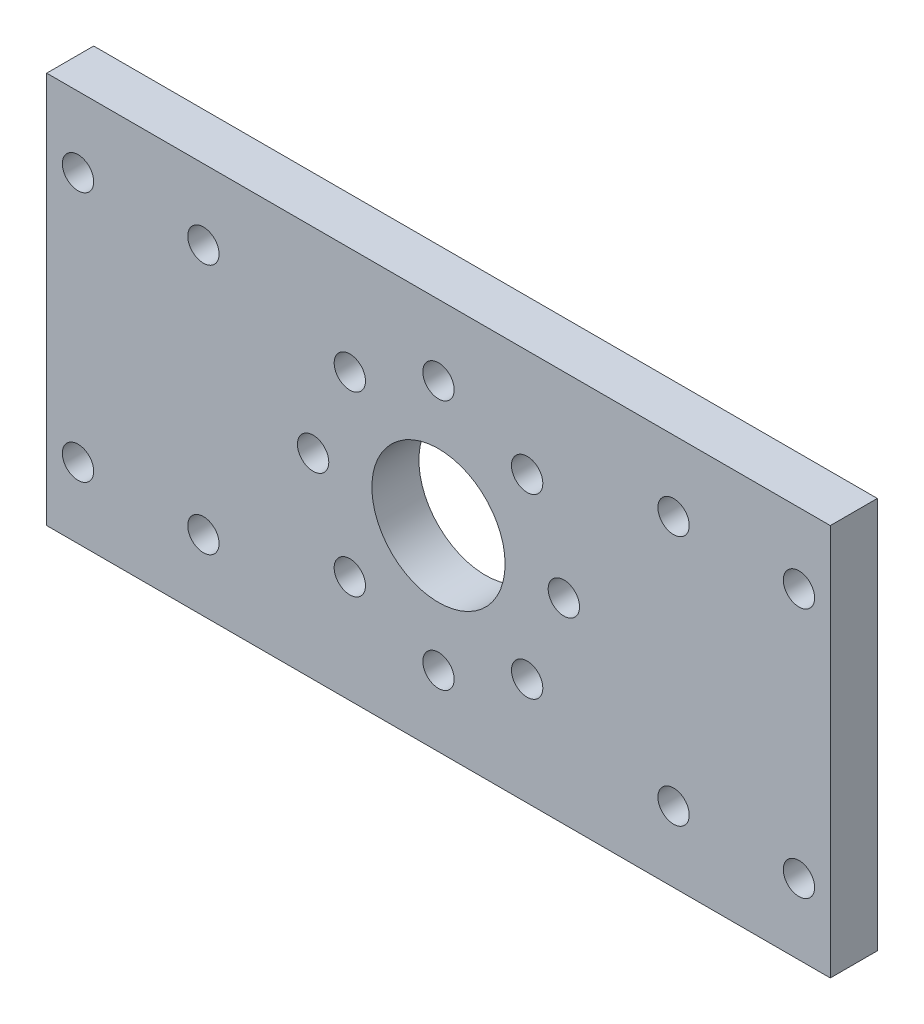
ISO-10303-21;
HEADER;
FILE_DESCRIPTION(('STEP AP214'),'2;1');
FILE_NAME('part.step','',(''),(''),'','','');
FILE_SCHEMA(('AUTOMOTIVE_DESIGN { 1 0 10303 214 1 1 1 1 }'));
ENDSEC;
DATA;
#1=APPLICATION_CONTEXT('core data for automotive mechanical design processes');
#2=APPLICATION_PROTOCOL_DEFINITION('international standard','automotive_design',2000,#1);
#3=PRODUCT_CONTEXT('',#1,'mechanical');
#4=PRODUCT('Part','Part','',(#3));
#5=PRODUCT_RELATED_PRODUCT_CATEGORY('part','',(#4));
#6=PRODUCT_DEFINITION_FORMATION('','',#4);
#7=PRODUCT_DEFINITION_CONTEXT('part definition',#1,'design');
#8=PRODUCT_DEFINITION('design','',#6,#7);
#9=PRODUCT_DEFINITION_SHAPE('','',#8);
#10=(LENGTH_UNIT() NAMED_UNIT(*) SI_UNIT(.MILLI.,.METRE.));
#11=(NAMED_UNIT(*) PLANE_ANGLE_UNIT() SI_UNIT($,.RADIAN.));
#12=(NAMED_UNIT(*) SI_UNIT($,.STERADIAN.) SOLID_ANGLE_UNIT());
#13=UNCERTAINTY_MEASURE_WITH_UNIT(LENGTH_MEASURE(1.E-05),#10,'distance_accuracy_value','');
#14=(GEOMETRIC_REPRESENTATION_CONTEXT(3) GLOBAL_UNCERTAINTY_ASSIGNED_CONTEXT((#13)) GLOBAL_UNIT_ASSIGNED_CONTEXT((#10,
#11,#12)) REPRESENTATION_CONTEXT('',''));
#15=CARTESIAN_POINT('',(0.,0.,0.));
#16=DIRECTION('',(0.,0.,1.));
#17=DIRECTION('',(1.,0.,0.));
#18=AXIS2_PLACEMENT_3D('',#15,#16,#17);
#19=CARTESIAN_POINT('',(0.,0.,3.));
#20=DIRECTION('',(0.,0.,1.));
#21=DIRECTION('',(1.,0.,0.));
#22=AXIS2_PLACEMENT_3D('',#19,#20,#21);
#23=PLANE('',#22);
#24=CARTESIAN_POINT('',(-23.,-8.,3.));
#25=DIRECTION('',(0.,0.,1.));
#26=DIRECTION('',(-1.,0.,0.));
#27=AXIS2_PLACEMENT_3D('',#24,#25,#26);
#28=CIRCLE('',#27,1.);
#29=CARTESIAN_POINT('',(-24.,-8.,3.));
#30=VERTEX_POINT('',#29);
#31=EDGE_CURVE('E200',#30,#30,#28,.T.);
#32=ORIENTED_EDGE('',*,*,#31,.F.);
#33=EDGE_LOOP('',(#32));
#34=FACE_BOUND('',#33,.T.);
#35=CARTESIAN_POINT('',(23.,8.,3.));
#36=DIRECTION('',(0.,0.,1.));
#37=DIRECTION('',(1.,0.,0.));
#38=AXIS2_PLACEMENT_3D('',#35,#36,#37);
#39=CIRCLE('',#38,1.);
#40=CARTESIAN_POINT('',(24.,8.,3.));
#41=VERTEX_POINT('',#40);
#42=EDGE_CURVE('E188',#41,#41,#39,.T.);
#43=ORIENTED_EDGE('',*,*,#42,.F.);
#44=EDGE_LOOP('',(#43));
#45=FACE_BOUND('',#44,.T.);
#46=CARTESIAN_POINT('',(15.,-8.,3.));
#47=DIRECTION('',(0.,0.,1.));
#48=DIRECTION('',(-1.,0.,0.));
#49=AXIS2_PLACEMENT_3D('',#46,#47,#48);
#50=CIRCLE('',#49,1.);
#51=CARTESIAN_POINT('',(14.,-8.,3.));
#52=VERTEX_POINT('',#51);
#53=EDGE_CURVE('E176',#52,#52,#50,.T.);
#54=ORIENTED_EDGE('',*,*,#53,.F.);
#55=EDGE_LOOP('',(#54));
#56=FACE_BOUND('',#55,.T.);
#57=CARTESIAN_POINT('',(-5.65685424949238,5.65685424949238,3.));
#58=DIRECTION('',(0.,0.,1.));
#59=DIRECTION('',(1.,0.,0.));
#60=AXIS2_PLACEMENT_3D('',#57,#58,#59);
#61=CIRCLE('',#60,1.0000000000001);
#62=CARTESIAN_POINT('',(-4.65685424949229,5.65685424949238,3.));
#63=VERTEX_POINT('',#62);
#64=EDGE_CURVE('E164',#63,#63,#61,.T.);
#65=ORIENTED_EDGE('',*,*,#64,.F.);
#66=EDGE_LOOP('',(#65));
#67=FACE_BOUND('',#66,.T.);
#68=CARTESIAN_POINT('',(-5.65685424949238,-5.65685424949238,3.));
#69=DIRECTION('',(0.,0.,1.));
#70=DIRECTION('',(1.,0.,0.));
#71=AXIS2_PLACEMENT_3D('',#68,#69,#70);
#72=CIRCLE('',#71,1.00000000000007);
#73=CARTESIAN_POINT('',(-4.65685424949231,-5.65685424949238,3.));
#74=VERTEX_POINT('',#73);
#75=EDGE_CURVE('E152',#74,#74,#72,.T.);
#76=ORIENTED_EDGE('',*,*,#75,.F.);
#77=EDGE_LOOP('',(#76));
#78=FACE_BOUND('',#77,.T.);
#79=CARTESIAN_POINT('',(5.65685424949238,-5.65685424949238,3.));
#80=DIRECTION('',(0.,0.,1.));
#81=DIRECTION('',(1.,0.,0.));
#82=AXIS2_PLACEMENT_3D('',#79,#80,#81);
#83=CIRCLE('',#82,1.00000000000004);
#84=CARTESIAN_POINT('',(6.65685424949242,-5.65685424949238,3.));
#85=VERTEX_POINT('',#84);
#86=EDGE_CURVE('E140',#85,#85,#83,.T.);
#87=ORIENTED_EDGE('',*,*,#86,.F.);
#88=EDGE_LOOP('',(#87));
#89=FACE_BOUND('',#88,.T.);
#90=CARTESIAN_POINT('',(5.65685424949238,5.65685424949238,3.));
#91=DIRECTION('',(0.,0.,1.));
#92=DIRECTION('',(1.,0.,0.));
#93=AXIS2_PLACEMENT_3D('',#90,#91,#92);
#94=CIRCLE('',#93,1.00000000000001);
#95=CARTESIAN_POINT('',(6.65685424949239,5.65685424949238,3.));
#96=VERTEX_POINT('',#95);
#97=EDGE_CURVE('E128',#96,#96,#94,.T.);
#98=ORIENTED_EDGE('',*,*,#97,.F.);
#99=EDGE_LOOP('',(#98));
#100=FACE_BOUND('',#99,.T.);
#101=CARTESIAN_POINT('',(0.,8.,3.));
#102=DIRECTION('',(0.,0.,1.));
#103=DIRECTION('',(1.,0.,0.));
#104=AXIS2_PLACEMENT_3D('',#101,#102,#103);
#105=CIRCLE('',#104,1.);
#106=CARTESIAN_POINT('',(1.,8.,3.));
#107=VERTEX_POINT('',#106);
#108=EDGE_CURVE('E116',#107,#107,#105,.T.);
#109=ORIENTED_EDGE('',*,*,#108,.F.);
#110=EDGE_LOOP('',(#109));
#111=FACE_BOUND('',#110,.T.);
#112=DIRECTION('',(0.,1.,0.));
#113=VECTOR('',#112,1.);
#114=CARTESIAN_POINT('',(25.,12.5,3.));
#115=LINE('',#114,#113);
#116=CARTESIAN_POINT('',(25.,-12.5,3.));
#117=VERTEX_POINT('',#116);
#118=CARTESIAN_POINT('',(25.,12.5,3.));
#119=VERTEX_POINT('',#118);
#120=EDGE_CURVE('E86',#117,#119,#115,.T.);
#121=ORIENTED_EDGE('',*,*,#120,.T.);
#122=DIRECTION('',(-1.,0.,0.));
#123=VECTOR('',#122,1.);
#124=CARTESIAN_POINT('',(-25.,12.5,3.));
#125=LINE('',#124,#123);
#126=CARTESIAN_POINT('',(-25.,12.5,3.));
#127=VERTEX_POINT('',#126);
#128=EDGE_CURVE('E81',#119,#127,#125,.T.);
#129=ORIENTED_EDGE('',*,*,#128,.T.);
#130=DIRECTION('',(0.,-1.,0.));
#131=VECTOR('',#130,1.);
#132=CARTESIAN_POINT('',(-25.,12.5,3.));
#133=LINE('',#132,#131);
#134=CARTESIAN_POINT('',(-25.,-12.5,3.));
#135=VERTEX_POINT('',#134);
#136=EDGE_CURVE('E84',#127,#135,#133,.T.);
#137=ORIENTED_EDGE('',*,*,#136,.T.);
#138=DIRECTION('',(1.,0.,0.));
#139=VECTOR('',#138,1.);
#140=CARTESIAN_POINT('',(-25.,-12.5,3.));
#141=LINE('',#140,#139);
#142=EDGE_CURVE('E51',#135,#117,#141,.T.);
#143=ORIENTED_EDGE('',*,*,#142,.T.);
#144=EDGE_LOOP('',(#121,#129,#137,#143));
#145=FACE_BOUND('',#144,.T.);
#146=CARTESIAN_POINT('',(0.,0.,3.));
#147=DIRECTION('',(0.,0.,1.));
#148=DIRECTION('',(1.,0.,0.));
#149=AXIS2_PLACEMENT_3D('',#146,#147,#148);
#150=CIRCLE('',#149,4.25);
#151=CARTESIAN_POINT('',(4.24999999999999,0.,3.));
#152=VERTEX_POINT('',#151);
#153=EDGE_CURVE('E101',#152,#152,#150,.T.);
#154=ORIENTED_EDGE('',*,*,#153,.F.);
#155=EDGE_LOOP('',(#154));
#156=FACE_BOUND('',#155,.T.);
#157=CARTESIAN_POINT('',(-15.,-8.,3.));
#158=DIRECTION('',(0.,0.,1.));
#159=DIRECTION('',(1.,0.,0.));
#160=AXIS2_PLACEMENT_3D('',#157,#158,#159);
#161=CIRCLE('',#160,1.);
#162=CARTESIAN_POINT('',(-14.,-8.,3.));
#163=VERTEX_POINT('',#162);
#164=EDGE_CURVE('E122',#163,#163,#161,.T.);
#165=ORIENTED_EDGE('',*,*,#164,.F.);
#166=EDGE_LOOP('',(#165));
#167=FACE_BOUND('',#166,.T.);
#168=CARTESIAN_POINT('',(8.,0.,3.));
#169=DIRECTION('',(0.,0.,1.));
#170=DIRECTION('',(1.,0.,0.));
#171=AXIS2_PLACEMENT_3D('',#168,#169,#170);
#172=CIRCLE('',#171,1.00000000000003);
#173=CARTESIAN_POINT('',(9.00000000000002,0.,3.));
#174=VERTEX_POINT('',#173);
#175=EDGE_CURVE('E134',#174,#174,#172,.T.);
#176=ORIENTED_EDGE('',*,*,#175,.F.);
#177=EDGE_LOOP('',(#176));
#178=FACE_BOUND('',#177,.T.);
#179=CARTESIAN_POINT('',(0.,-8.,3.));
#180=DIRECTION('',(0.,0.,1.));
#181=DIRECTION('',(1.,0.,0.));
#182=AXIS2_PLACEMENT_3D('',#179,#180,#181);
#183=CIRCLE('',#182,1.00000000000005);
#184=CARTESIAN_POINT('',(1.00000000000005,-8.,3.));
#185=VERTEX_POINT('',#184);
#186=EDGE_CURVE('E146',#185,#185,#183,.T.);
#187=ORIENTED_EDGE('',*,*,#186,.F.);
#188=EDGE_LOOP('',(#187));
#189=FACE_BOUND('',#188,.T.);
#190=CARTESIAN_POINT('',(-8.,0.,3.));
#191=DIRECTION('',(0.,0.,1.));
#192=DIRECTION('',(1.,0.,0.));
#193=AXIS2_PLACEMENT_3D('',#190,#191,#192);
#194=CIRCLE('',#193,1.00000000000008);
#195=CARTESIAN_POINT('',(-6.99999999999992,0.,3.));
#196=VERTEX_POINT('',#195);
#197=EDGE_CURVE('E158',#196,#196,#194,.T.);
#198=ORIENTED_EDGE('',*,*,#197,.F.);
#199=EDGE_LOOP('',(#198));
#200=FACE_BOUND('',#199,.T.);
#201=CARTESIAN_POINT('',(-15.,8.,3.));
#202=DIRECTION('',(0.,0.,1.));
#203=DIRECTION('',(1.,0.,0.));
#204=AXIS2_PLACEMENT_3D('',#201,#202,#203);
#205=CIRCLE('',#204,1.);
#206=CARTESIAN_POINT('',(-14.,8.,3.));
#207=VERTEX_POINT('',#206);
#208=EDGE_CURVE('E170',#207,#207,#205,.T.);
#209=ORIENTED_EDGE('',*,*,#208,.F.);
#210=EDGE_LOOP('',(#209));
#211=FACE_BOUND('',#210,.T.);
#212=CARTESIAN_POINT('',(15.,8.,3.));
#213=DIRECTION('',(0.,0.,1.));
#214=DIRECTION('',(-1.,0.,0.));
#215=AXIS2_PLACEMENT_3D('',#212,#213,#214);
#216=CIRCLE('',#215,1.00000000000001);
#217=CARTESIAN_POINT('',(14.,8.,3.));
#218=VERTEX_POINT('',#217);
#219=EDGE_CURVE('E182',#218,#218,#216,.T.);
#220=ORIENTED_EDGE('',*,*,#219,.F.);
#221=EDGE_LOOP('',(#220));
#222=FACE_BOUND('',#221,.T.);
#223=CARTESIAN_POINT('',(23.,-8.,3.));
#224=DIRECTION('',(0.,0.,1.));
#225=DIRECTION('',(1.,0.,0.));
#226=AXIS2_PLACEMENT_3D('',#223,#224,#225);
#227=CIRCLE('',#226,1.);
#228=CARTESIAN_POINT('',(24.,-8.,3.));
#229=VERTEX_POINT('',#228);
#230=EDGE_CURVE('E194',#229,#229,#227,.T.);
#231=ORIENTED_EDGE('',*,*,#230,.F.);
#232=EDGE_LOOP('',(#231));
#233=FACE_BOUND('',#232,.T.);
#234=CARTESIAN_POINT('',(-23.,8.,3.));
#235=DIRECTION('',(0.,0.,1.));
#236=DIRECTION('',(-1.,0.,0.));
#237=AXIS2_PLACEMENT_3D('',#234,#235,#236);
#238=CIRCLE('',#237,1.);
#239=CARTESIAN_POINT('',(-24.,8.,3.));
#240=VERTEX_POINT('',#239);
#241=EDGE_CURVE('E206',#240,#240,#238,.T.);
#242=ORIENTED_EDGE('',*,*,#241,.F.);
#243=EDGE_LOOP('',(#242));
#244=FACE_BOUND('',#243,.T.);
#245=ADVANCED_FACE('F34',(#34,#45,#56,#67,#78,#89,#100,#111,#145,#156,#167,#178,#189,#200,#211,
#222,#233,#244),#23,.T.);
#246=CARTESIAN_POINT('',(0.,0.,0.));
#247=DIRECTION('',(0.,0.,1.));
#248=DIRECTION('',(1.,0.,0.));
#249=AXIS2_PLACEMENT_3D('',#246,#247,#248);
#250=PLANE('',#249);
#251=DIRECTION('',(0.,1.,0.));
#252=VECTOR('',#251,1.);
#253=CARTESIAN_POINT('',(25.,12.5,0.));
#254=LINE('',#253,#252);
#255=CARTESIAN_POINT('',(25.,-12.5,0.));
#256=VERTEX_POINT('',#255);
#257=CARTESIAN_POINT('',(25.,12.5,0.));
#258=VERTEX_POINT('',#257);
#259=EDGE_CURVE('E98',#256,#258,#254,.T.);
#260=ORIENTED_EDGE('',*,*,#259,.F.);
#261=DIRECTION('',(1.,0.,0.));
#262=VECTOR('',#261,1.);
#263=CARTESIAN_POINT('',(-25.,-12.5,0.));
#264=LINE('',#263,#262);
#265=CARTESIAN_POINT('',(-25.,-12.5,0.));
#266=VERTEX_POINT('',#265);
#267=EDGE_CURVE('E74',#266,#256,#264,.T.);
#268=ORIENTED_EDGE('',*,*,#267,.F.);
#269=DIRECTION('',(0.,-1.,0.));
#270=VECTOR('',#269,1.);
#271=CARTESIAN_POINT('',(-25.,12.5,0.));
#272=LINE('',#271,#270);
#273=CARTESIAN_POINT('',(-25.,12.5,0.));
#274=VERTEX_POINT('',#273);
#275=EDGE_CURVE('E68',#274,#266,#272,.T.);
#276=ORIENTED_EDGE('',*,*,#275,.F.);
#277=DIRECTION('',(-1.,0.,0.));
#278=VECTOR('',#277,1.);
#279=CARTESIAN_POINT('',(-25.,12.5,0.));
#280=LINE('',#279,#278);
#281=EDGE_CURVE('E90',#258,#274,#280,.T.);
#282=ORIENTED_EDGE('',*,*,#281,.F.);
#283=EDGE_LOOP('',(#260,#268,#276,#282));
#284=FACE_BOUND('',#283,.T.);
#285=CARTESIAN_POINT('',(0.,0.,0.));
#286=DIRECTION('',(0.,0.,1.));
#287=DIRECTION('',(1.,0.,0.));
#288=AXIS2_PLACEMENT_3D('',#285,#286,#287);
#289=CIRCLE('',#288,4.25);
#290=CARTESIAN_POINT('',(4.24999999999999,0.,0.));
#291=VERTEX_POINT('',#290);
#292=EDGE_CURVE('E113',#291,#291,#289,.T.);
#293=ORIENTED_EDGE('',*,*,#292,.T.);
#294=EDGE_LOOP('',(#293));
#295=FACE_BOUND('',#294,.T.);
#296=CARTESIAN_POINT('',(0.,8.,0.));
#297=DIRECTION('',(0.,0.,1.));
#298=DIRECTION('',(1.,0.,0.));
#299=AXIS2_PLACEMENT_3D('',#296,#297,#298);
#300=CIRCLE('',#299,1.);
#301=CARTESIAN_POINT('',(1.,8.,0.));
#302=VERTEX_POINT('',#301);
#303=EDGE_CURVE('E119',#302,#302,#300,.T.);
#304=ORIENTED_EDGE('',*,*,#303,.T.);
#305=EDGE_LOOP('',(#304));
#306=FACE_BOUND('',#305,.T.);
#307=CARTESIAN_POINT('',(-15.,-8.,0.));
#308=DIRECTION('',(0.,0.,1.));
#309=DIRECTION('',(1.,0.,0.));
#310=AXIS2_PLACEMENT_3D('',#307,#308,#309);
#311=CIRCLE('',#310,1.);
#312=CARTESIAN_POINT('',(-14.,-8.,0.));
#313=VERTEX_POINT('',#312);
#314=EDGE_CURVE('E125',#313,#313,#311,.T.);
#315=ORIENTED_EDGE('',*,*,#314,.T.);
#316=EDGE_LOOP('',(#315));
#317=FACE_BOUND('',#316,.T.);
#318=CARTESIAN_POINT('',(5.65685424949238,5.65685424949238,0.));
#319=DIRECTION('',(0.,0.,1.));
#320=DIRECTION('',(1.,0.,0.));
#321=AXIS2_PLACEMENT_3D('',#318,#319,#320);
#322=CIRCLE('',#321,1.00000000000001);
#323=CARTESIAN_POINT('',(6.65685424949239,5.65685424949238,0.));
#324=VERTEX_POINT('',#323);
#325=EDGE_CURVE('E131',#324,#324,#322,.T.);
#326=ORIENTED_EDGE('',*,*,#325,.T.);
#327=EDGE_LOOP('',(#326));
#328=FACE_BOUND('',#327,.T.);
#329=CARTESIAN_POINT('',(8.,0.,0.));
#330=DIRECTION('',(0.,0.,1.));
#331=DIRECTION('',(1.,0.,0.));
#332=AXIS2_PLACEMENT_3D('',#329,#330,#331);
#333=CIRCLE('',#332,1.00000000000003);
#334=CARTESIAN_POINT('',(9.00000000000002,0.,0.));
#335=VERTEX_POINT('',#334);
#336=EDGE_CURVE('E137',#335,#335,#333,.T.);
#337=ORIENTED_EDGE('',*,*,#336,.T.);
#338=EDGE_LOOP('',(#337));
#339=FACE_BOUND('',#338,.T.);
#340=CARTESIAN_POINT('',(5.65685424949238,-5.65685424949238,0.));
#341=DIRECTION('',(0.,0.,1.));
#342=DIRECTION('',(1.,0.,0.));
#343=AXIS2_PLACEMENT_3D('',#340,#341,#342);
#344=CIRCLE('',#343,1.00000000000004);
#345=CARTESIAN_POINT('',(6.65685424949242,-5.65685424949238,0.));
#346=VERTEX_POINT('',#345);
#347=EDGE_CURVE('E143',#346,#346,#344,.T.);
#348=ORIENTED_EDGE('',*,*,#347,.T.);
#349=EDGE_LOOP('',(#348));
#350=FACE_BOUND('',#349,.T.);
#351=CARTESIAN_POINT('',(0.,-8.,0.));
#352=DIRECTION('',(0.,0.,1.));
#353=DIRECTION('',(1.,0.,0.));
#354=AXIS2_PLACEMENT_3D('',#351,#352,#353);
#355=CIRCLE('',#354,1.00000000000005);
#356=CARTESIAN_POINT('',(1.00000000000005,-8.,0.));
#357=VERTEX_POINT('',#356);
#358=EDGE_CURVE('E149',#357,#357,#355,.T.);
#359=ORIENTED_EDGE('',*,*,#358,.T.);
#360=EDGE_LOOP('',(#359));
#361=FACE_BOUND('',#360,.T.);
#362=CARTESIAN_POINT('',(-5.65685424949238,-5.65685424949238,0.));
#363=DIRECTION('',(0.,0.,1.));
#364=DIRECTION('',(1.,0.,0.));
#365=AXIS2_PLACEMENT_3D('',#362,#363,#364);
#366=CIRCLE('',#365,1.00000000000007);
#367=CARTESIAN_POINT('',(-4.65685424949231,-5.65685424949238,0.));
#368=VERTEX_POINT('',#367);
#369=EDGE_CURVE('E155',#368,#368,#366,.T.);
#370=ORIENTED_EDGE('',*,*,#369,.T.);
#371=EDGE_LOOP('',(#370));
#372=FACE_BOUND('',#371,.T.);
#373=CARTESIAN_POINT('',(-8.,0.,0.));
#374=DIRECTION('',(0.,0.,1.));
#375=DIRECTION('',(1.,0.,0.));
#376=AXIS2_PLACEMENT_3D('',#373,#374,#375);
#377=CIRCLE('',#376,1.00000000000008);
#378=CARTESIAN_POINT('',(-6.99999999999992,0.,0.));
#379=VERTEX_POINT('',#378);
#380=EDGE_CURVE('E161',#379,#379,#377,.T.);
#381=ORIENTED_EDGE('',*,*,#380,.T.);
#382=EDGE_LOOP('',(#381));
#383=FACE_BOUND('',#382,.T.);
#384=CARTESIAN_POINT('',(-5.65685424949238,5.65685424949238,0.));
#385=DIRECTION('',(0.,0.,1.));
#386=DIRECTION('',(1.,0.,0.));
#387=AXIS2_PLACEMENT_3D('',#384,#385,#386);
#388=CIRCLE('',#387,1.0000000000001);
#389=CARTESIAN_POINT('',(-4.65685424949229,5.65685424949238,0.));
#390=VERTEX_POINT('',#389);
#391=EDGE_CURVE('E167',#390,#390,#388,.T.);
#392=ORIENTED_EDGE('',*,*,#391,.T.);
#393=EDGE_LOOP('',(#392));
#394=FACE_BOUND('',#393,.T.);
#395=CARTESIAN_POINT('',(-15.,8.,0.));
#396=DIRECTION('',(0.,0.,1.));
#397=DIRECTION('',(1.,0.,0.));
#398=AXIS2_PLACEMENT_3D('',#395,#396,#397);
#399=CIRCLE('',#398,1.);
#400=CARTESIAN_POINT('',(-14.,8.,0.));
#401=VERTEX_POINT('',#400);
#402=EDGE_CURVE('E173',#401,#401,#399,.T.);
#403=ORIENTED_EDGE('',*,*,#402,.T.);
#404=EDGE_LOOP('',(#403));
#405=FACE_BOUND('',#404,.T.);
#406=CARTESIAN_POINT('',(15.,-8.,0.));
#407=DIRECTION('',(0.,0.,1.));
#408=DIRECTION('',(-1.,0.,0.));
#409=AXIS2_PLACEMENT_3D('',#406,#407,#408);
#410=CIRCLE('',#409,1.);
#411=CARTESIAN_POINT('',(14.,-8.,0.));
#412=VERTEX_POINT('',#411);
#413=EDGE_CURVE('E179',#412,#412,#410,.T.);
#414=ORIENTED_EDGE('',*,*,#413,.T.);
#415=EDGE_LOOP('',(#414));
#416=FACE_BOUND('',#415,.T.);
#417=CARTESIAN_POINT('',(15.,8.,0.));
#418=DIRECTION('',(0.,0.,1.));
#419=DIRECTION('',(-1.,0.,0.));
#420=AXIS2_PLACEMENT_3D('',#417,#418,#419);
#421=CIRCLE('',#420,1.00000000000001);
#422=CARTESIAN_POINT('',(14.,8.,0.));
#423=VERTEX_POINT('',#422);
#424=EDGE_CURVE('E185',#423,#423,#421,.T.);
#425=ORIENTED_EDGE('',*,*,#424,.T.);
#426=EDGE_LOOP('',(#425));
#427=FACE_BOUND('',#426,.T.);
#428=CARTESIAN_POINT('',(23.,8.,0.));
#429=DIRECTION('',(0.,0.,1.));
#430=DIRECTION('',(1.,0.,0.));
#431=AXIS2_PLACEMENT_3D('',#428,#429,#430);
#432=CIRCLE('',#431,1.);
#433=CARTESIAN_POINT('',(24.,8.,0.));
#434=VERTEX_POINT('',#433);
#435=EDGE_CURVE('E191',#434,#434,#432,.T.);
#436=ORIENTED_EDGE('',*,*,#435,.T.);
#437=EDGE_LOOP('',(#436));
#438=FACE_BOUND('',#437,.T.);
#439=CARTESIAN_POINT('',(23.,-8.,0.));
#440=DIRECTION('',(0.,0.,1.));
#441=DIRECTION('',(1.,0.,0.));
#442=AXIS2_PLACEMENT_3D('',#439,#440,#441);
#443=CIRCLE('',#442,1.);
#444=CARTESIAN_POINT('',(24.,-8.,0.));
#445=VERTEX_POINT('',#444);
#446=EDGE_CURVE('E197',#445,#445,#443,.T.);
#447=ORIENTED_EDGE('',*,*,#446,.T.);
#448=EDGE_LOOP('',(#447));
#449=FACE_BOUND('',#448,.T.);
#450=CARTESIAN_POINT('',(-23.,-8.,0.));
#451=DIRECTION('',(0.,0.,1.));
#452=DIRECTION('',(-1.,0.,0.));
#453=AXIS2_PLACEMENT_3D('',#450,#451,#452);
#454=CIRCLE('',#453,1.);
#455=CARTESIAN_POINT('',(-24.,-8.,0.));
#456=VERTEX_POINT('',#455);
#457=EDGE_CURVE('E203',#456,#456,#454,.T.);
#458=ORIENTED_EDGE('',*,*,#457,.T.);
#459=EDGE_LOOP('',(#458));
#460=FACE_BOUND('',#459,.T.);
#461=CARTESIAN_POINT('',(-23.,8.,0.));
#462=DIRECTION('',(0.,0.,1.));
#463=DIRECTION('',(-1.,0.,0.));
#464=AXIS2_PLACEMENT_3D('',#461,#462,#463);
#465=CIRCLE('',#464,1.);
#466=CARTESIAN_POINT('',(-24.,8.,0.));
#467=VERTEX_POINT('',#466);
#468=EDGE_CURVE('E209',#467,#467,#465,.T.);
#469=ORIENTED_EDGE('',*,*,#468,.T.);
#470=EDGE_LOOP('',(#469));
#471=FACE_BOUND('',#470,.T.);
#472=ADVANCED_FACE('F109',(#284,#295,#306,#317,#328,#339,#350,#361,#372,#383,#394,#405,#416,
#427,#438,#449,#460,#471),#250,.F.);
#473=CARTESIAN_POINT('',(25.,12.5,3.));
#474=DIRECTION('',(-1.,0.,0.));
#475=DIRECTION('',(0.,0.,1.));
#476=AXIS2_PLACEMENT_3D('',#473,#474,#475);
#477=PLANE('',#476);
#478=ORIENTED_EDGE('',*,*,#259,.T.);
#479=DIRECTION('',(0.,0.,-1.));
#480=VECTOR('',#479,1.);
#481=CARTESIAN_POINT('',(25.,12.5,3.));
#482=LINE('',#481,#480);
#483=EDGE_CURVE('E11',#119,#258,#482,.T.);
#484=ORIENTED_EDGE('',*,*,#483,.F.);
#485=ORIENTED_EDGE('',*,*,#120,.F.);
#486=DIRECTION('',(0.,0.,-1.));
#487=VECTOR('',#486,1.);
#488=CARTESIAN_POINT('',(25.,-12.5,3.));
#489=LINE('',#488,#487);
#490=EDGE_CURVE('E94',#117,#256,#489,.T.);
#491=ORIENTED_EDGE('',*,*,#490,.T.);
#492=EDGE_LOOP('',(#478,#484,#485,#491));
#493=FACE_BOUND('',#492,.T.);
#494=ADVANCED_FACE('F36',(#493),#477,.F.);
#495=CARTESIAN_POINT('',(-25.,12.5,3.));
#496=DIRECTION('',(0.,-1.,0.));
#497=DIRECTION('',(0.,0.,-1.));
#498=AXIS2_PLACEMENT_3D('',#495,#496,#497);
#499=PLANE('',#498);
#500=ORIENTED_EDGE('',*,*,#281,.T.);
#501=DIRECTION('',(0.,0.,-1.));
#502=VECTOR('',#501,1.);
#503=CARTESIAN_POINT('',(-25.,12.5,3.));
#504=LINE('',#503,#502);
#505=EDGE_CURVE('E43',#127,#274,#504,.T.);
#506=ORIENTED_EDGE('',*,*,#505,.F.);
#507=ORIENTED_EDGE('',*,*,#128,.F.);
#508=ORIENTED_EDGE('',*,*,#483,.T.);
#509=EDGE_LOOP('',(#500,#506,#507,#508));
#510=FACE_BOUND('',#509,.T.);
#511=ADVANCED_FACE('F89',(#510),#499,.F.);
#512=CARTESIAN_POINT('',(-25.,12.5,3.));
#513=DIRECTION('',(1.,0.,0.));
#514=DIRECTION('',(0.,0.,-1.));
#515=AXIS2_PLACEMENT_3D('',#512,#513,#514);
#516=PLANE('',#515);
#517=ORIENTED_EDGE('',*,*,#275,.T.);
#518=DIRECTION('',(0.,0.,-1.));
#519=VECTOR('',#518,1.);
#520=CARTESIAN_POINT('',(-25.,-12.5,3.));
#521=LINE('',#520,#519);
#522=EDGE_CURVE('E91',#135,#266,#521,.T.);
#523=ORIENTED_EDGE('',*,*,#522,.F.);
#524=ORIENTED_EDGE('',*,*,#136,.F.);
#525=ORIENTED_EDGE('',*,*,#505,.T.);
#526=EDGE_LOOP('',(#517,#523,#524,#525));
#527=FACE_BOUND('',#526,.T.);
#528=ADVANCED_FACE('F92',(#527),#516,.F.);
#529=CARTESIAN_POINT('',(-25.,-12.5,3.));
#530=DIRECTION('',(0.,1.,0.));
#531=DIRECTION('',(0.,0.,1.));
#532=AXIS2_PLACEMENT_3D('',#529,#530,#531);
#533=PLANE('',#532);
#534=ORIENTED_EDGE('',*,*,#267,.T.);
#535=ORIENTED_EDGE('',*,*,#490,.F.);
#536=ORIENTED_EDGE('',*,*,#142,.F.);
#537=ORIENTED_EDGE('',*,*,#522,.T.);
#538=EDGE_LOOP('',(#534,#535,#536,#537));
#539=FACE_BOUND('',#538,.T.);
#540=ADVANCED_FACE('F106',(#539),#533,.F.);
#541=CARTESIAN_POINT('',(0.,0.,3.));
#542=DIRECTION('',(0.,0.,-1.));
#543=DIRECTION('',(-1.,0.,0.));
#544=AXIS2_PLACEMENT_3D('',#541,#542,#543);
#545=CYLINDRICAL_SURFACE('',#544,4.25);
#546=ORIENTED_EDGE('',*,*,#153,.T.);
#547=EDGE_LOOP('',(#546));
#548=FACE_BOUND('',#547,.T.);
#549=ORIENTED_EDGE('',*,*,#292,.F.);
#550=EDGE_LOOP('',(#549));
#551=FACE_BOUND('',#550,.T.);
#552=ADVANCED_FACE('F228',(#548,#551),#545,.F.);
#553=CARTESIAN_POINT('',(0.,8.,3.));
#554=DIRECTION('',(0.,0.,-1.));
#555=DIRECTION('',(-1.,0.,0.));
#556=AXIS2_PLACEMENT_3D('',#553,#554,#555);
#557=CYLINDRICAL_SURFACE('',#556,1.);
#558=ORIENTED_EDGE('',*,*,#108,.T.);
#559=EDGE_LOOP('',(#558));
#560=FACE_BOUND('',#559,.T.);
#561=ORIENTED_EDGE('',*,*,#303,.F.);
#562=EDGE_LOOP('',(#561));
#563=FACE_BOUND('',#562,.T.);
#564=ADVANCED_FACE('F274',(#560,#563),#557,.F.);
#565=CARTESIAN_POINT('',(-15.,-8.,3.));
#566=DIRECTION('',(0.,0.,-1.));
#567=DIRECTION('',(-1.,0.,0.));
#568=AXIS2_PLACEMENT_3D('',#565,#566,#567);
#569=CYLINDRICAL_SURFACE('',#568,1.);
#570=ORIENTED_EDGE('',*,*,#164,.T.);
#571=EDGE_LOOP('',(#570));
#572=FACE_BOUND('',#571,.T.);
#573=ORIENTED_EDGE('',*,*,#314,.F.);
#574=EDGE_LOOP('',(#573));
#575=FACE_BOUND('',#574,.T.);
#576=ADVANCED_FACE('F282',(#572,#575),#569,.F.);
#577=CARTESIAN_POINT('',(5.65685424949238,5.65685424949238,3.));
#578=DIRECTION('',(0.,0.,-1.));
#579=DIRECTION('',(-1.,0.,0.));
#580=AXIS2_PLACEMENT_3D('',#577,#578,#579);
#581=CYLINDRICAL_SURFACE('',#580,1.00000000000001);
#582=ORIENTED_EDGE('',*,*,#97,.T.);
#583=EDGE_LOOP('',(#582));
#584=FACE_BOUND('',#583,.T.);
#585=ORIENTED_EDGE('',*,*,#325,.F.);
#586=EDGE_LOOP('',(#585));
#587=FACE_BOUND('',#586,.T.);
#588=ADVANCED_FACE('F290',(#584,#587),#581,.F.);
#589=CARTESIAN_POINT('',(8.,0.,3.));
#590=DIRECTION('',(0.,0.,-1.));
#591=DIRECTION('',(-1.,0.,0.));
#592=AXIS2_PLACEMENT_3D('',#589,#590,#591);
#593=CYLINDRICAL_SURFACE('',#592,1.00000000000003);
#594=ORIENTED_EDGE('',*,*,#175,.T.);
#595=EDGE_LOOP('',(#594));
#596=FACE_BOUND('',#595,.T.);
#597=ORIENTED_EDGE('',*,*,#336,.F.);
#598=EDGE_LOOP('',(#597));
#599=FACE_BOUND('',#598,.T.);
#600=ADVANCED_FACE('F299',(#596,#599),#593,.F.);
#601=CARTESIAN_POINT('',(5.65685424949238,-5.65685424949238,3.));
#602=DIRECTION('',(0.,0.,-1.));
#603=DIRECTION('',(-1.,0.,0.));
#604=AXIS2_PLACEMENT_3D('',#601,#602,#603);
#605=CYLINDRICAL_SURFACE('',#604,1.00000000000004);
#606=ORIENTED_EDGE('',*,*,#86,.T.);
#607=EDGE_LOOP('',(#606));
#608=FACE_BOUND('',#607,.T.);
#609=ORIENTED_EDGE('',*,*,#347,.F.);
#610=EDGE_LOOP('',(#609));
#611=FACE_BOUND('',#610,.T.);
#612=ADVANCED_FACE('F308',(#608,#611),#605,.F.);
#613=CARTESIAN_POINT('',(0.,-8.,3.));
#614=DIRECTION('',(0.,0.,-1.));
#615=DIRECTION('',(-1.,0.,0.));
#616=AXIS2_PLACEMENT_3D('',#613,#614,#615);
#617=CYLINDRICAL_SURFACE('',#616,1.00000000000005);
#618=ORIENTED_EDGE('',*,*,#186,.T.);
#619=EDGE_LOOP('',(#618));
#620=FACE_BOUND('',#619,.T.);
#621=ORIENTED_EDGE('',*,*,#358,.F.);
#622=EDGE_LOOP('',(#621));
#623=FACE_BOUND('',#622,.T.);
#624=ADVANCED_FACE('F317',(#620,#623),#617,.F.);
#625=CARTESIAN_POINT('',(-5.65685424949238,-5.65685424949238,3.));
#626=DIRECTION('',(0.,0.,-1.));
#627=DIRECTION('',(-1.,0.,0.));
#628=AXIS2_PLACEMENT_3D('',#625,#626,#627);
#629=CYLINDRICAL_SURFACE('',#628,1.00000000000007);
#630=ORIENTED_EDGE('',*,*,#75,.T.);
#631=EDGE_LOOP('',(#630));
#632=FACE_BOUND('',#631,.T.);
#633=ORIENTED_EDGE('',*,*,#369,.F.);
#634=EDGE_LOOP('',(#633));
#635=FACE_BOUND('',#634,.T.);
#636=ADVANCED_FACE('F326',(#632,#635),#629,.F.);
#637=CARTESIAN_POINT('',(-8.,0.,3.));
#638=DIRECTION('',(0.,0.,-1.));
#639=DIRECTION('',(-1.,0.,0.));
#640=AXIS2_PLACEMENT_3D('',#637,#638,#639);
#641=CYLINDRICAL_SURFACE('',#640,1.00000000000008);
#642=ORIENTED_EDGE('',*,*,#197,.T.);
#643=EDGE_LOOP('',(#642));
#644=FACE_BOUND('',#643,.T.);
#645=ORIENTED_EDGE('',*,*,#380,.F.);
#646=EDGE_LOOP('',(#645));
#647=FACE_BOUND('',#646,.T.);
#648=ADVANCED_FACE('F335',(#644,#647),#641,.F.);
#649=CARTESIAN_POINT('',(-5.65685424949238,5.65685424949238,3.));
#650=DIRECTION('',(0.,0.,-1.));
#651=DIRECTION('',(-1.,0.,0.));
#652=AXIS2_PLACEMENT_3D('',#649,#650,#651);
#653=CYLINDRICAL_SURFACE('',#652,1.0000000000001);
#654=ORIENTED_EDGE('',*,*,#64,.T.);
#655=EDGE_LOOP('',(#654));
#656=FACE_BOUND('',#655,.T.);
#657=ORIENTED_EDGE('',*,*,#391,.F.);
#658=EDGE_LOOP('',(#657));
#659=FACE_BOUND('',#658,.T.);
#660=ADVANCED_FACE('F344',(#656,#659),#653,.F.);
#661=CARTESIAN_POINT('',(-15.,8.,3.));
#662=DIRECTION('',(0.,0.,-1.));
#663=DIRECTION('',(-1.,0.,0.));
#664=AXIS2_PLACEMENT_3D('',#661,#662,#663);
#665=CYLINDRICAL_SURFACE('',#664,1.);
#666=ORIENTED_EDGE('',*,*,#208,.T.);
#667=EDGE_LOOP('',(#666));
#668=FACE_BOUND('',#667,.T.);
#669=ORIENTED_EDGE('',*,*,#402,.F.);
#670=EDGE_LOOP('',(#669));
#671=FACE_BOUND('',#670,.T.);
#672=ADVANCED_FACE('F353',(#668,#671),#665,.F.);
#673=CARTESIAN_POINT('',(15.,-8.,3.));
#674=DIRECTION('',(0.,0.,-1.));
#675=DIRECTION('',(-1.,0.,0.));
#676=AXIS2_PLACEMENT_3D('',#673,#674,#675);
#677=CYLINDRICAL_SURFACE('',#676,1.);
#678=ORIENTED_EDGE('',*,*,#53,.T.);
#679=EDGE_LOOP('',(#678));
#680=FACE_BOUND('',#679,.T.);
#681=ORIENTED_EDGE('',*,*,#413,.F.);
#682=EDGE_LOOP('',(#681));
#683=FACE_BOUND('',#682,.T.);
#684=ADVANCED_FACE('F362',(#680,#683),#677,.F.);
#685=CARTESIAN_POINT('',(15.,8.,3.));
#686=DIRECTION('',(0.,0.,-1.));
#687=DIRECTION('',(-1.,0.,0.));
#688=AXIS2_PLACEMENT_3D('',#685,#686,#687);
#689=CYLINDRICAL_SURFACE('',#688,1.00000000000001);
#690=ORIENTED_EDGE('',*,*,#219,.T.);
#691=EDGE_LOOP('',(#690));
#692=FACE_BOUND('',#691,.T.);
#693=ORIENTED_EDGE('',*,*,#424,.F.);
#694=EDGE_LOOP('',(#693));
#695=FACE_BOUND('',#694,.T.);
#696=ADVANCED_FACE('F371',(#692,#695),#689,.F.);
#697=CARTESIAN_POINT('',(23.,8.,3.));
#698=DIRECTION('',(0.,0.,-1.));
#699=DIRECTION('',(-1.,0.,0.));
#700=AXIS2_PLACEMENT_3D('',#697,#698,#699);
#701=CYLINDRICAL_SURFACE('',#700,1.);
#702=ORIENTED_EDGE('',*,*,#42,.T.);
#703=EDGE_LOOP('',(#702));
#704=FACE_BOUND('',#703,.T.);
#705=ORIENTED_EDGE('',*,*,#435,.F.);
#706=EDGE_LOOP('',(#705));
#707=FACE_BOUND('',#706,.T.);
#708=ADVANCED_FACE('F380',(#704,#707),#701,.F.);
#709=CARTESIAN_POINT('',(23.,-8.,3.));
#710=DIRECTION('',(0.,0.,-1.));
#711=DIRECTION('',(-1.,0.,0.));
#712=AXIS2_PLACEMENT_3D('',#709,#710,#711);
#713=CYLINDRICAL_SURFACE('',#712,1.);
#714=ORIENTED_EDGE('',*,*,#230,.T.);
#715=EDGE_LOOP('',(#714));
#716=FACE_BOUND('',#715,.T.);
#717=ORIENTED_EDGE('',*,*,#446,.F.);
#718=EDGE_LOOP('',(#717));
#719=FACE_BOUND('',#718,.T.);
#720=ADVANCED_FACE('F389',(#716,#719),#713,.F.);
#721=CARTESIAN_POINT('',(-23.,-8.,3.));
#722=DIRECTION('',(0.,0.,-1.));
#723=DIRECTION('',(-1.,0.,0.));
#724=AXIS2_PLACEMENT_3D('',#721,#722,#723);
#725=CYLINDRICAL_SURFACE('',#724,1.);
#726=ORIENTED_EDGE('',*,*,#31,.T.);
#727=EDGE_LOOP('',(#726));
#728=FACE_BOUND('',#727,.T.);
#729=ORIENTED_EDGE('',*,*,#457,.F.);
#730=EDGE_LOOP('',(#729));
#731=FACE_BOUND('',#730,.T.);
#732=ADVANCED_FACE('F398',(#728,#731),#725,.F.);
#733=CARTESIAN_POINT('',(-23.,8.,3.));
#734=DIRECTION('',(0.,0.,-1.));
#735=DIRECTION('',(-1.,0.,0.));
#736=AXIS2_PLACEMENT_3D('',#733,#734,#735);
#737=CYLINDRICAL_SURFACE('',#736,1.);
#738=ORIENTED_EDGE('',*,*,#241,.T.);
#739=EDGE_LOOP('',(#738));
#740=FACE_BOUND('',#739,.T.);
#741=ORIENTED_EDGE('',*,*,#468,.F.);
#742=EDGE_LOOP('',(#741));
#743=FACE_BOUND('',#742,.T.);
#744=ADVANCED_FACE('F215',(#740,#743),#737,.F.);
#745=CLOSED_SHELL('',(#245,#472,#494,#511,#528,#540,#552,#564,#576,#588,#600,#612,#624,#636,
#648,#660,#672,#684,#696,#708,#720,#732,#744));
#746=MANIFOLD_SOLID_BREP('B2',#745);
#747=ADVANCED_BREP_SHAPE_REPRESENTATION('',(#18,#746),#14);
#748=SHAPE_DEFINITION_REPRESENTATION(#9,#747);
ENDSEC;
END-ISO-10303-21;
